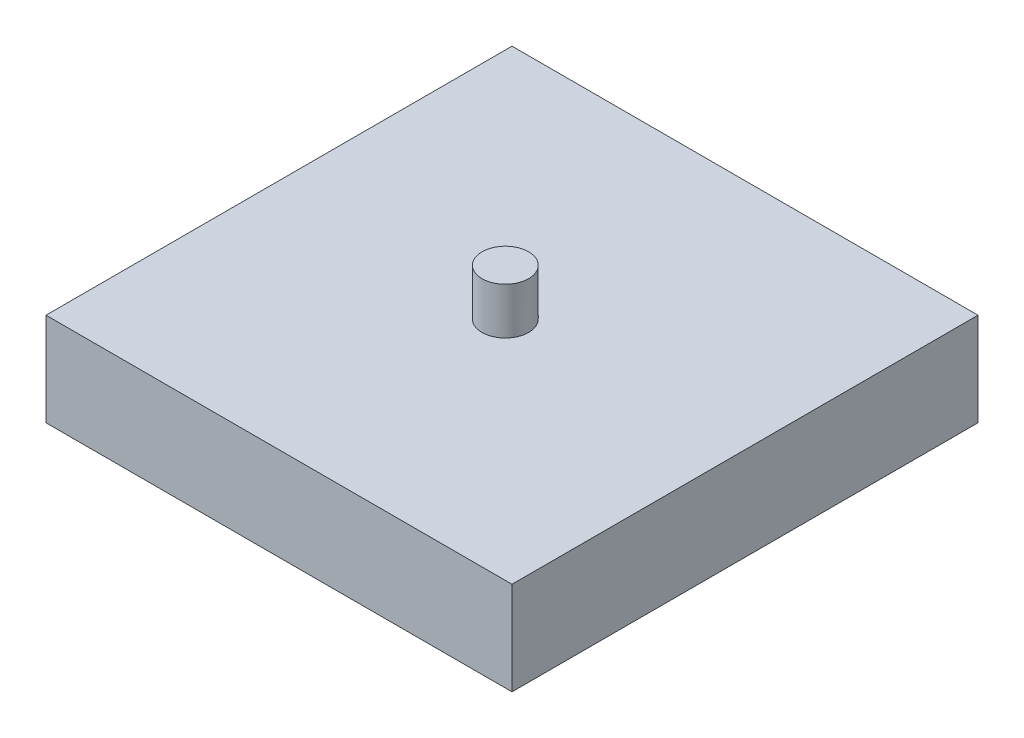
ISO-10303-21;
HEADER;
FILE_DESCRIPTION(('STEP AP214'),'2;1');
FILE_NAME('part.step','',(''),(''),'','','');
FILE_SCHEMA(('AUTOMOTIVE_DESIGN { 1 0 10303 214 1 1 1 1 }'));
ENDSEC;
DATA;
#1=APPLICATION_CONTEXT('core data for automotive mechanical design processes');
#2=APPLICATION_PROTOCOL_DEFINITION('international standard','automotive_design',2000,#1);
#3=PRODUCT_CONTEXT('',#1,'mechanical');
#4=PRODUCT('Part','Part','',(#3));
#5=PRODUCT_RELATED_PRODUCT_CATEGORY('part','',(#4));
#6=PRODUCT_DEFINITION_FORMATION('','',#4);
#7=PRODUCT_DEFINITION_CONTEXT('part definition',#1,'design');
#8=PRODUCT_DEFINITION('design','',#6,#7);
#9=PRODUCT_DEFINITION_SHAPE('','',#8);
#10=(LENGTH_UNIT() NAMED_UNIT(*) SI_UNIT(.MILLI.,.METRE.));
#11=(NAMED_UNIT(*) PLANE_ANGLE_UNIT() SI_UNIT($,.RADIAN.));
#12=(NAMED_UNIT(*) SI_UNIT($,.STERADIAN.) SOLID_ANGLE_UNIT());
#13=UNCERTAINTY_MEASURE_WITH_UNIT(LENGTH_MEASURE(1.E-05),#10,'distance_accuracy_value','');
#14=(GEOMETRIC_REPRESENTATION_CONTEXT(3) GLOBAL_UNCERTAINTY_ASSIGNED_CONTEXT((#13)) GLOBAL_UNIT_ASSIGNED_CONTEXT((#10,
#11,#12)) REPRESENTATION_CONTEXT('',''));
#15=CARTESIAN_POINT('',(0.,0.,0.));
#16=DIRECTION('',(0.,0.,1.));
#17=DIRECTION('',(1.,0.,0.));
#18=AXIS2_PLACEMENT_3D('',#15,#16,#17);
#19=CARTESIAN_POINT('',(-250.,100.,-257.151146392043));
#20=DIRECTION('',(0.,0.,-1.));
#21=DIRECTION('',(-1.,0.,0.));
#22=AXIS2_PLACEMENT_3D('',#19,#20,#21);
#23=PLANE('',#22);
#24=DIRECTION('',(1.,0.,0.));
#25=VECTOR('',#24,1.);
#26=CARTESIAN_POINT('',(-250.,0.,-257.151146392043));
#27=LINE('',#26,#25);
#28=CARTESIAN_POINT('',(-250.,0.,-257.151146392043));
#29=VERTEX_POINT('',#28);
#30=CARTESIAN_POINT('',(250.,0.,-257.151146392043));
#31=VERTEX_POINT('',#30);
#32=EDGE_CURVE('E107',#29,#31,#27,.T.);
#33=ORIENTED_EDGE('',*,*,#32,.F.);
#34=DIRECTION('',(0.,-1.,0.));
#35=VECTOR('',#34,1.);
#36=CARTESIAN_POINT('',(-250.,100.,-257.151146392043));
#37=LINE('',#36,#35);
#38=CARTESIAN_POINT('',(-250.,100.,-257.151146392043));
#39=VERTEX_POINT('',#38);
#40=EDGE_CURVE('E47',#39,#29,#37,.T.);
#41=ORIENTED_EDGE('',*,*,#40,.F.);
#42=DIRECTION('',(1.,0.,0.));
#43=VECTOR('',#42,1.);
#44=CARTESIAN_POINT('',(-250.,100.,-257.151146392043));
#45=LINE('',#44,#43);
#46=CARTESIAN_POINT('',(250.,100.,-257.151146392043));
#47=VERTEX_POINT('',#46);
#48=EDGE_CURVE('E101',#39,#47,#45,.T.);
#49=ORIENTED_EDGE('',*,*,#48,.T.);
#50=DIRECTION('',(0.,-1.,0.));
#51=VECTOR('',#50,1.);
#52=CARTESIAN_POINT('',(250.,100.,-257.151146392043));
#53=LINE('',#52,#51);
#54=EDGE_CURVE('E79',#47,#31,#53,.T.);
#55=ORIENTED_EDGE('',*,*,#54,.T.);
#56=EDGE_LOOP('',(#33,#41,#49,#55));
#57=FACE_BOUND('',#56,.T.);
#58=ADVANCED_FACE('F39',(#57),#23,.T.);
#59=CARTESIAN_POINT('',(-250.,100.,-257.151146392043));
#60=DIRECTION('',(1.,0.,0.));
#61=DIRECTION('',(0.,0.,-1.));
#62=AXIS2_PLACEMENT_3D('',#59,#60,#61);
#63=PLANE('',#62);
#64=DIRECTION('',(0.,0.,1.));
#65=VECTOR('',#64,1.);
#66=CARTESIAN_POINT('',(-250.,0.,-257.151146392043));
#67=LINE('',#66,#65);
#68=CARTESIAN_POINT('',(-250.,0.,242.848853607957));
#69=VERTEX_POINT('',#68);
#70=EDGE_CURVE('E71',#29,#69,#67,.T.);
#71=ORIENTED_EDGE('',*,*,#70,.T.);
#72=DIRECTION('',(0.,-1.,0.));
#73=VECTOR('',#72,1.);
#74=CARTESIAN_POINT('',(-250.,100.,242.848853607957));
#75=LINE('',#74,#73);
#76=CARTESIAN_POINT('',(-250.,100.,242.848853607957));
#77=VERTEX_POINT('',#76);
#78=EDGE_CURVE('E98',#77,#69,#75,.T.);
#79=ORIENTED_EDGE('',*,*,#78,.F.);
#80=DIRECTION('',(0.,0.,1.));
#81=VECTOR('',#80,1.);
#82=CARTESIAN_POINT('',(-250.,100.,-257.151146392043));
#83=LINE('',#82,#81);
#84=EDGE_CURVE('E89',#39,#77,#83,.T.);
#85=ORIENTED_EDGE('',*,*,#84,.F.);
#86=ORIENTED_EDGE('',*,*,#40,.T.);
#87=EDGE_LOOP('',(#71,#79,#85,#86));
#88=FACE_BOUND('',#87,.T.);
#89=ADVANCED_FACE('F132',(#88),#63,.F.);
#90=CARTESIAN_POINT('',(-250.,100.,242.848853607957));
#91=DIRECTION('',(0.,0.,-1.));
#92=DIRECTION('',(-1.,0.,0.));
#93=AXIS2_PLACEMENT_3D('',#90,#91,#92);
#94=PLANE('',#93);
#95=DIRECTION('',(1.,0.,0.));
#96=VECTOR('',#95,1.);
#97=CARTESIAN_POINT('',(-250.,0.,242.848853607957));
#98=LINE('',#97,#96);
#99=CARTESIAN_POINT('',(250.,0.,242.848853607957));
#100=VERTEX_POINT('',#99);
#101=EDGE_CURVE('E96',#69,#100,#98,.T.);
#102=ORIENTED_EDGE('',*,*,#101,.T.);
#103=DIRECTION('',(0.,-1.,0.));
#104=VECTOR('',#103,1.);
#105=CARTESIAN_POINT('',(250.,100.,242.848853607957));
#106=LINE('',#105,#104);
#107=CARTESIAN_POINT('',(250.,100.,242.848853607957));
#108=VERTEX_POINT('',#107);
#109=EDGE_CURVE('E93',#108,#100,#106,.T.);
#110=ORIENTED_EDGE('',*,*,#109,.F.);
#111=DIRECTION('',(1.,0.,0.));
#112=VECTOR('',#111,1.);
#113=CARTESIAN_POINT('',(-250.,100.,242.848853607957));
#114=LINE('',#113,#112);
#115=EDGE_CURVE('E84',#77,#108,#114,.T.);
#116=ORIENTED_EDGE('',*,*,#115,.F.);
#117=ORIENTED_EDGE('',*,*,#78,.T.);
#118=EDGE_LOOP('',(#102,#110,#116,#117));
#119=FACE_BOUND('',#118,.T.);
#120=ADVANCED_FACE('F94',(#119),#94,.F.);
#121=CARTESIAN_POINT('',(250.,100.,-257.151146392043));
#122=DIRECTION('',(1.,0.,0.));
#123=DIRECTION('',(0.,0.,-1.));
#124=AXIS2_PLACEMENT_3D('',#121,#122,#123);
#125=PLANE('',#124);
#126=DIRECTION('',(0.,0.,1.));
#127=VECTOR('',#126,1.);
#128=CARTESIAN_POINT('',(250.,0.,-257.151146392043));
#129=LINE('',#128,#127);
#130=EDGE_CURVE('E110',#31,#100,#129,.T.);
#131=ORIENTED_EDGE('',*,*,#130,.F.);
#132=ORIENTED_EDGE('',*,*,#54,.F.);
#133=DIRECTION('',(0.,0.,1.));
#134=VECTOR('',#133,1.);
#135=CARTESIAN_POINT('',(250.,100.,-257.151146392043));
#136=LINE('',#135,#134);
#137=EDGE_CURVE('E88',#47,#108,#136,.T.);
#138=ORIENTED_EDGE('',*,*,#137,.T.);
#139=ORIENTED_EDGE('',*,*,#109,.T.);
#140=EDGE_LOOP('',(#131,#132,#138,#139));
#141=FACE_BOUND('',#140,.T.);
#142=ADVANCED_FACE('F100',(#141),#125,.T.);
#143=CARTESIAN_POINT('',(0.,100.,0.));
#144=DIRECTION('',(0.,-1.,0.));
#145=DIRECTION('',(0.,0.,-1.));
#146=AXIS2_PLACEMENT_3D('',#143,#144,#145);
#147=PLANE('',#146);
#148=CARTESIAN_POINT('',(0.,100.,0.));
#149=DIRECTION('',(0.,-1.,0.));
#150=DIRECTION('',(0.,0.,-1.));
#151=AXIS2_PLACEMENT_3D('',#148,#149,#150);
#152=CIRCLE('',#151,25.);
#153=CARTESIAN_POINT('',(0.,100.,-25.));
#154=VERTEX_POINT('',#153);
#155=EDGE_CURVE('E11',#154,#154,#152,.F.);
#156=ORIENTED_EDGE('',*,*,#155,.F.);
#157=EDGE_LOOP('',(#156));
#158=FACE_BOUND('',#157,.T.);
#159=ORIENTED_EDGE('',*,*,#48,.F.);
#160=ORIENTED_EDGE('',*,*,#84,.T.);
#161=ORIENTED_EDGE('',*,*,#115,.T.);
#162=ORIENTED_EDGE('',*,*,#137,.F.);
#163=EDGE_LOOP('',(#159,#160,#161,#162));
#164=FACE_BOUND('',#163,.T.);
#165=ADVANCED_FACE('F87',(#158,#164),#147,.F.);
#166=CARTESIAN_POINT('',(0.,0.,0.));
#167=DIRECTION('',(0.,-1.,0.));
#168=DIRECTION('',(0.,0.,-1.));
#169=AXIS2_PLACEMENT_3D('',#166,#167,#168);
#170=PLANE('',#169);
#171=ORIENTED_EDGE('',*,*,#32,.T.);
#172=ORIENTED_EDGE('',*,*,#130,.T.);
#173=ORIENTED_EDGE('',*,*,#101,.F.);
#174=ORIENTED_EDGE('',*,*,#70,.F.);
#175=EDGE_LOOP('',(#171,#172,#173,#174));
#176=FACE_BOUND('',#175,.T.);
#177=ADVANCED_FACE('F117',(#176),#170,.T.);
#178=CARTESIAN_POINT('',(0.,150.,0.));
#179=DIRECTION('',(0.,-1.,0.));
#180=DIRECTION('',(0.,0.,-1.));
#181=AXIS2_PLACEMENT_3D('',#178,#179,#180);
#182=CYLINDRICAL_SURFACE('',#181,25.);
#183=CARTESIAN_POINT('',(0.,150.,0.));
#184=DIRECTION('',(0.,1.,0.));
#185=DIRECTION('',(0.,0.,1.));
#186=AXIS2_PLACEMENT_3D('',#183,#184,#185);
#187=CIRCLE('',#186,25.);
#188=CARTESIAN_POINT('',(0.,150.,25.));
#189=VERTEX_POINT('',#188);
#190=EDGE_CURVE('E111',#189,#189,#187,.T.);
#191=ORIENTED_EDGE('',*,*,#190,.F.);
#192=EDGE_LOOP('',(#191));
#193=FACE_BOUND('',#192,.T.);
#194=ORIENTED_EDGE('',*,*,#155,.T.);
#195=EDGE_LOOP('',(#194));
#196=FACE_BOUND('',#195,.T.);
#197=ADVANCED_FACE('F119',(#193,#196),#182,.T.);
#198=CARTESIAN_POINT('',(0.,150.,0.));
#199=DIRECTION('',(0.,1.,0.));
#200=DIRECTION('',(0.,0.,1.));
#201=AXIS2_PLACEMENT_3D('',#198,#199,#200);
#202=PLANE('',#201);
#203=ORIENTED_EDGE('',*,*,#190,.T.);
#204=EDGE_LOOP('',(#203));
#205=FACE_BOUND('',#204,.T.);
#206=ADVANCED_FACE('F125',(#205),#202,.T.);
#207=CLOSED_SHELL('',(#58,#89,#120,#142,#165,#177,#197,#206));
#208=MANIFOLD_SOLID_BREP('B2',#207);
#209=ADVANCED_BREP_SHAPE_REPRESENTATION('',(#18,#208),#14);
#210=SHAPE_DEFINITION_REPRESENTATION(#9,#209);
ENDSEC;
END-ISO-10303-21;
